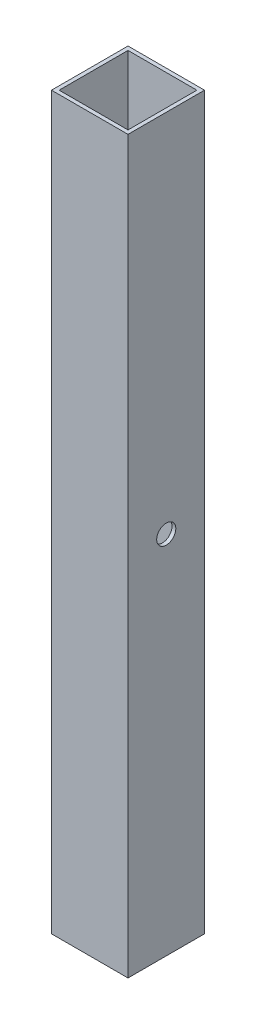
ISO-10303-21;
HEADER;
FILE_DESCRIPTION(('STEP AP214'),'2;1');
FILE_NAME('part.step','',(''),(''),'','','');
FILE_SCHEMA(('AUTOMOTIVE_DESIGN { 1 0 10303 214 1 1 1 1 }'));
ENDSEC;
DATA;
#1=APPLICATION_CONTEXT('core data for automotive mechanical design processes');
#2=APPLICATION_PROTOCOL_DEFINITION('international standard','automotive_design',2000,#1);
#3=PRODUCT_CONTEXT('',#1,'mechanical');
#4=PRODUCT('Part','Part','',(#3));
#5=PRODUCT_RELATED_PRODUCT_CATEGORY('part','',(#4));
#6=PRODUCT_DEFINITION_FORMATION('','',#4);
#7=PRODUCT_DEFINITION_CONTEXT('part definition',#1,'design');
#8=PRODUCT_DEFINITION('design','',#6,#7);
#9=PRODUCT_DEFINITION_SHAPE('','',#8);
#10=(LENGTH_UNIT() NAMED_UNIT(*) SI_UNIT(.MILLI.,.METRE.));
#11=(NAMED_UNIT(*) PLANE_ANGLE_UNIT() SI_UNIT($,.RADIAN.));
#12=(NAMED_UNIT(*) SI_UNIT($,.STERADIAN.) SOLID_ANGLE_UNIT());
#13=UNCERTAINTY_MEASURE_WITH_UNIT(LENGTH_MEASURE(1.E-05),#10,'distance_accuracy_value','');
#14=(GEOMETRIC_REPRESENTATION_CONTEXT(3) GLOBAL_UNCERTAINTY_ASSIGNED_CONTEXT((#13)) GLOBAL_UNIT_ASSIGNED_CONTEXT((#10,
#11,#12)) REPRESENTATION_CONTEXT('',''));
#15=CARTESIAN_POINT('',(0.,0.,0.));
#16=DIRECTION('',(0.,0.,1.));
#17=DIRECTION('',(1.,0.,0.));
#18=AXIS2_PLACEMENT_3D('',#15,#16,#17);
#19=CARTESIAN_POINT('',(0.,191.,0.));
#20=DIRECTION('',(0.,-1.,0.));
#21=DIRECTION('',(0.,0.,-1.));
#22=AXIS2_PLACEMENT_3D('',#19,#20,#21);
#23=PLANE('',#22);
#24=DIRECTION('',(0.,0.,-1.));
#25=VECTOR('',#24,1.);
#26=CARTESIAN_POINT('',(9.99999999999999,191.,10.));
#27=LINE('',#26,#25);
#28=CARTESIAN_POINT('',(9.99999999999999,191.,10.));
#29=VERTEX_POINT('',#28);
#30=CARTESIAN_POINT('',(9.99999999999999,191.,-9.99999999999999));
#31=VERTEX_POINT('',#30);
#32=EDGE_CURVE('E137',#29,#31,#27,.T.);
#33=ORIENTED_EDGE('',*,*,#32,.T.);
#34=DIRECTION('',(-1.,0.,0.));
#35=VECTOR('',#34,1.);
#36=CARTESIAN_POINT('',(-10.,191.,-9.99999999999999));
#37=LINE('',#36,#35);
#38=CARTESIAN_POINT('',(-10.,191.,-9.99999999999999));
#39=VERTEX_POINT('',#38);
#40=EDGE_CURVE('E140',#31,#39,#37,.T.);
#41=ORIENTED_EDGE('',*,*,#40,.T.);
#42=DIRECTION('',(0.,0.,1.));
#43=VECTOR('',#42,1.);
#44=CARTESIAN_POINT('',(-10.,191.,10.));
#45=LINE('',#44,#43);
#46=CARTESIAN_POINT('',(-10.,191.,10.));
#47=VERTEX_POINT('',#46);
#48=EDGE_CURVE('E143',#39,#47,#45,.T.);
#49=ORIENTED_EDGE('',*,*,#48,.T.);
#50=DIRECTION('',(1.,0.,0.));
#51=VECTOR('',#50,1.);
#52=CARTESIAN_POINT('',(-10.,191.,10.));
#53=LINE('',#52,#51);
#54=EDGE_CURVE('E145',#47,#29,#53,.T.);
#55=ORIENTED_EDGE('',*,*,#54,.T.);
#56=EDGE_LOOP('',(#33,#41,#49,#55));
#57=FACE_BOUND('',#56,.T.);
#58=DIRECTION('',(0.,0.,-1.));
#59=VECTOR('',#58,1.);
#60=CARTESIAN_POINT('',(9.,191.,9.));
#61=LINE('',#60,#59);
#62=CARTESIAN_POINT('',(9.,191.,9.));
#63=VERTEX_POINT('',#62);
#64=CARTESIAN_POINT('',(9.,191.,-9.));
#65=VERTEX_POINT('',#64);
#66=EDGE_CURVE('E99',#63,#65,#61,.T.);
#67=ORIENTED_EDGE('',*,*,#66,.F.);
#68=DIRECTION('',(1.,0.,0.));
#69=VECTOR('',#68,1.);
#70=CARTESIAN_POINT('',(-9.,191.,9.));
#71=LINE('',#70,#69);
#72=CARTESIAN_POINT('',(-9.,191.,9.));
#73=VERTEX_POINT('',#72);
#74=EDGE_CURVE('E121',#73,#63,#71,.T.);
#75=ORIENTED_EDGE('',*,*,#74,.F.);
#76=DIRECTION('',(0.,0.,1.));
#77=VECTOR('',#76,1.);
#78=CARTESIAN_POINT('',(-9.,191.,9.));
#79=LINE('',#78,#77);
#80=CARTESIAN_POINT('',(-9.,191.,-9.));
#81=VERTEX_POINT('',#80);
#82=EDGE_CURVE('E119',#81,#73,#79,.T.);
#83=ORIENTED_EDGE('',*,*,#82,.F.);
#84=DIRECTION('',(-1.,0.,0.));
#85=VECTOR('',#84,1.);
#86=CARTESIAN_POINT('',(-9.,191.,-9.));
#87=LINE('',#86,#85);
#88=EDGE_CURVE('E107',#65,#81,#87,.T.);
#89=ORIENTED_EDGE('',*,*,#88,.F.);
#90=EDGE_LOOP('',(#67,#75,#83,#89));
#91=FACE_BOUND('',#90,.T.);
#92=ADVANCED_FACE('F33',(#57,#91),#23,.F.);
#93=CARTESIAN_POINT('',(0.,0.,0.));
#94=DIRECTION('',(0.,-1.,0.));
#95=DIRECTION('',(0.,0.,-1.));
#96=AXIS2_PLACEMENT_3D('',#93,#94,#95);
#97=PLANE('',#96);
#98=DIRECTION('',(0.,0.,-1.));
#99=VECTOR('',#98,1.);
#100=CARTESIAN_POINT('',(9.99999999999999,0.,10.));
#101=LINE('',#100,#99);
#102=CARTESIAN_POINT('',(9.99999999999999,0.,10.));
#103=VERTEX_POINT('',#102);
#104=CARTESIAN_POINT('',(9.99999999999999,0.,-9.99999999999999));
#105=VERTEX_POINT('',#104);
#106=EDGE_CURVE('E115',#103,#105,#101,.T.);
#107=ORIENTED_EDGE('',*,*,#106,.F.);
#108=DIRECTION('',(1.,0.,0.));
#109=VECTOR('',#108,1.);
#110=CARTESIAN_POINT('',(-10.,0.,10.));
#111=LINE('',#110,#109);
#112=CARTESIAN_POINT('',(-10.,0.,10.));
#113=VERTEX_POINT('',#112);
#114=EDGE_CURVE('E141',#113,#103,#111,.T.);
#115=ORIENTED_EDGE('',*,*,#114,.F.);
#116=DIRECTION('',(0.,0.,1.));
#117=VECTOR('',#116,1.);
#118=CARTESIAN_POINT('',(-10.,0.,10.));
#119=LINE('',#118,#117);
#120=CARTESIAN_POINT('',(-10.,0.,-9.99999999999999));
#121=VERTEX_POINT('',#120);
#122=EDGE_CURVE('E152',#121,#113,#119,.T.);
#123=ORIENTED_EDGE('',*,*,#122,.F.);
#124=DIRECTION('',(-1.,0.,0.));
#125=VECTOR('',#124,1.);
#126=CARTESIAN_POINT('',(-10.,0.,-9.99999999999999));
#127=LINE('',#126,#125);
#128=EDGE_CURVE('E150',#105,#121,#127,.T.);
#129=ORIENTED_EDGE('',*,*,#128,.F.);
#130=EDGE_LOOP('',(#107,#115,#123,#129));
#131=FACE_BOUND('',#130,.T.);
#132=DIRECTION('',(1.,0.,0.));
#133=VECTOR('',#132,1.);
#134=CARTESIAN_POINT('',(-9.,0.,9.));
#135=LINE('',#134,#133);
#136=CARTESIAN_POINT('',(-9.,0.,9.));
#137=VERTEX_POINT('',#136);
#138=CARTESIAN_POINT('',(9.,0.,9.));
#139=VERTEX_POINT('',#138);
#140=EDGE_CURVE('E108',#137,#139,#135,.T.);
#141=ORIENTED_EDGE('',*,*,#140,.T.);
#142=DIRECTION('',(0.,0.,-1.));
#143=VECTOR('',#142,1.);
#144=CARTESIAN_POINT('',(9.,0.,9.));
#145=LINE('',#144,#143);
#146=CARTESIAN_POINT('',(9.,0.,-9.));
#147=VERTEX_POINT('',#146);
#148=EDGE_CURVE('E57',#139,#147,#145,.T.);
#149=ORIENTED_EDGE('',*,*,#148,.T.);
#150=DIRECTION('',(-1.,0.,0.));
#151=VECTOR('',#150,1.);
#152=CARTESIAN_POINT('',(-9.,0.,-9.));
#153=LINE('',#152,#151);
#154=CARTESIAN_POINT('',(-9.,0.,-9.));
#155=VERTEX_POINT('',#154);
#156=EDGE_CURVE('E114',#147,#155,#153,.T.);
#157=ORIENTED_EDGE('',*,*,#156,.T.);
#158=DIRECTION('',(0.,0.,1.));
#159=VECTOR('',#158,1.);
#160=CARTESIAN_POINT('',(-9.,0.,9.));
#161=LINE('',#160,#159);
#162=EDGE_CURVE('E129',#155,#137,#161,.T.);
#163=ORIENTED_EDGE('',*,*,#162,.T.);
#164=EDGE_LOOP('',(#141,#149,#157,#163));
#165=FACE_BOUND('',#164,.T.);
#166=ADVANCED_FACE('F171',(#131,#165),#97,.T.);
#167=CARTESIAN_POINT('',(9.99999999999999,191.,10.));
#168=DIRECTION('',(-1.,0.,0.));
#169=DIRECTION('',(0.,0.,1.));
#170=AXIS2_PLACEMENT_3D('',#167,#168,#169);
#171=PLANE('',#170);
#172=CARTESIAN_POINT('',(9.99999999999999,95.5,0.));
#173=DIRECTION('',(-1.,0.,0.));
#174=DIRECTION('',(0.,0.,1.));
#175=AXIS2_PLACEMENT_3D('',#172,#173,#174);
#176=CIRCLE('',#175,2.5);
#177=CARTESIAN_POINT('',(9.99999999999999,95.5,2.5));
#178=VERTEX_POINT('',#177);
#179=EDGE_CURVE('E218',#178,#178,#176,.T.);
#180=ORIENTED_EDGE('',*,*,#179,.T.);
#181=EDGE_LOOP('',(#180));
#182=FACE_BOUND('',#181,.T.);
#183=ORIENTED_EDGE('',*,*,#106,.T.);
#184=DIRECTION('',(0.,-1.,0.));
#185=VECTOR('',#184,1.);
#186=CARTESIAN_POINT('',(9.99999999999999,191.,-9.99999999999999));
#187=LINE('',#186,#185);
#188=EDGE_CURVE('E11',#31,#105,#187,.T.);
#189=ORIENTED_EDGE('',*,*,#188,.F.);
#190=ORIENTED_EDGE('',*,*,#32,.F.);
#191=DIRECTION('',(0.,-1.,0.));
#192=VECTOR('',#191,1.);
#193=CARTESIAN_POINT('',(9.99999999999999,191.,10.));
#194=LINE('',#193,#192);
#195=EDGE_CURVE('E147',#29,#103,#194,.T.);
#196=ORIENTED_EDGE('',*,*,#195,.T.);
#197=EDGE_LOOP('',(#183,#189,#190,#196));
#198=FACE_BOUND('',#197,.T.);
#199=ADVANCED_FACE('F35',(#182,#198),#171,.F.);
#200=CARTESIAN_POINT('',(-10.,191.,-9.99999999999999));
#201=DIRECTION('',(0.,0.,1.));
#202=DIRECTION('',(1.,0.,0.));
#203=AXIS2_PLACEMENT_3D('',#200,#201,#202);
#204=PLANE('',#203);
#205=ORIENTED_EDGE('',*,*,#128,.T.);
#206=DIRECTION('',(0.,-1.,0.));
#207=VECTOR('',#206,1.);
#208=CARTESIAN_POINT('',(-10.,191.,-9.99999999999999));
#209=LINE('',#208,#207);
#210=EDGE_CURVE('E42',#39,#121,#209,.T.);
#211=ORIENTED_EDGE('',*,*,#210,.F.);
#212=ORIENTED_EDGE('',*,*,#40,.F.);
#213=ORIENTED_EDGE('',*,*,#188,.T.);
#214=EDGE_LOOP('',(#205,#211,#212,#213));
#215=FACE_BOUND('',#214,.T.);
#216=ADVANCED_FACE('F181',(#215),#204,.F.);
#217=CARTESIAN_POINT('',(-10.,191.,10.));
#218=DIRECTION('',(1.,0.,0.));
#219=DIRECTION('',(0.,0.,-1.));
#220=AXIS2_PLACEMENT_3D('',#217,#218,#219);
#221=PLANE('',#220);
#222=CARTESIAN_POINT('',(-10.,95.5,0.));
#223=DIRECTION('',(1.,0.,0.));
#224=DIRECTION('',(0.,0.,-1.));
#225=AXIS2_PLACEMENT_3D('',#222,#223,#224);
#226=CIRCLE('',#225,2.5);
#227=CARTESIAN_POINT('',(-10.,95.5,-2.5));
#228=VERTEX_POINT('',#227);
#229=EDGE_CURVE('E127',#228,#228,#226,.T.);
#230=ORIENTED_EDGE('',*,*,#229,.T.);
#231=EDGE_LOOP('',(#230));
#232=FACE_BOUND('',#231,.T.);
#233=ORIENTED_EDGE('',*,*,#122,.T.);
#234=DIRECTION('',(0.,-1.,0.));
#235=VECTOR('',#234,1.);
#236=CARTESIAN_POINT('',(-10.,191.,10.));
#237=LINE('',#236,#235);
#238=EDGE_CURVE('E157',#47,#113,#237,.T.);
#239=ORIENTED_EDGE('',*,*,#238,.F.);
#240=ORIENTED_EDGE('',*,*,#48,.F.);
#241=ORIENTED_EDGE('',*,*,#210,.T.);
#242=EDGE_LOOP('',(#233,#239,#240,#241));
#243=FACE_BOUND('',#242,.T.);
#244=ADVANCED_FACE('F165',(#232,#243),#221,.F.);
#245=CARTESIAN_POINT('',(-10.,191.,10.));
#246=DIRECTION('',(0.,0.,-1.));
#247=DIRECTION('',(-1.,0.,0.));
#248=AXIS2_PLACEMENT_3D('',#245,#246,#247);
#249=PLANE('',#248);
#250=ORIENTED_EDGE('',*,*,#114,.T.);
#251=ORIENTED_EDGE('',*,*,#195,.F.);
#252=ORIENTED_EDGE('',*,*,#54,.F.);
#253=ORIENTED_EDGE('',*,*,#238,.T.);
#254=EDGE_LOOP('',(#250,#251,#252,#253));
#255=FACE_BOUND('',#254,.T.);
#256=ADVANCED_FACE('F175',(#255),#249,.F.);
#257=CARTESIAN_POINT('',(9.,191.,9.));
#258=DIRECTION('',(-1.,0.,0.));
#259=DIRECTION('',(0.,0.,1.));
#260=AXIS2_PLACEMENT_3D('',#257,#258,#259);
#261=PLANE('',#260);
#262=CARTESIAN_POINT('',(9.,95.5,0.));
#263=DIRECTION('',(-1.,0.,0.));
#264=DIRECTION('',(0.,0.,1.));
#265=AXIS2_PLACEMENT_3D('',#262,#263,#264);
#266=CIRCLE('',#265,2.5);
#267=CARTESIAN_POINT('',(9.,95.5,2.5));
#268=VERTEX_POINT('',#267);
#269=EDGE_CURVE('E213',#268,#268,#266,.T.);
#270=ORIENTED_EDGE('',*,*,#269,.F.);
#271=EDGE_LOOP('',(#270));
#272=FACE_BOUND('',#271,.T.);
#273=ORIENTED_EDGE('',*,*,#148,.F.);
#274=DIRECTION('',(0.,-1.,0.));
#275=VECTOR('',#274,1.);
#276=CARTESIAN_POINT('',(9.,191.,9.));
#277=LINE('',#276,#275);
#278=EDGE_CURVE('E103',#63,#139,#277,.T.);
#279=ORIENTED_EDGE('',*,*,#278,.F.);
#280=ORIENTED_EDGE('',*,*,#66,.T.);
#281=DIRECTION('',(0.,-1.,0.));
#282=VECTOR('',#281,1.);
#283=CARTESIAN_POINT('',(9.,191.,-9.));
#284=LINE('',#283,#282);
#285=EDGE_CURVE('E102',#65,#147,#284,.T.);
#286=ORIENTED_EDGE('',*,*,#285,.T.);
#287=EDGE_LOOP('',(#273,#279,#280,#286));
#288=FACE_BOUND('',#287,.T.);
#289=ADVANCED_FACE('F101',(#272,#288),#261,.T.);
#290=CARTESIAN_POINT('',(-9.,191.,-9.));
#291=DIRECTION('',(0.,0.,1.));
#292=DIRECTION('',(1.,0.,0.));
#293=AXIS2_PLACEMENT_3D('',#290,#291,#292);
#294=PLANE('',#293);
#295=ORIENTED_EDGE('',*,*,#156,.F.);
#296=ORIENTED_EDGE('',*,*,#285,.F.);
#297=ORIENTED_EDGE('',*,*,#88,.T.);
#298=DIRECTION('',(0.,-1.,0.));
#299=VECTOR('',#298,1.);
#300=CARTESIAN_POINT('',(-9.,191.,-9.));
#301=LINE('',#300,#299);
#302=EDGE_CURVE('E116',#81,#155,#301,.T.);
#303=ORIENTED_EDGE('',*,*,#302,.T.);
#304=EDGE_LOOP('',(#295,#296,#297,#303));
#305=FACE_BOUND('',#304,.T.);
#306=ADVANCED_FACE('F111',(#305),#294,.T.);
#307=CARTESIAN_POINT('',(-9.,191.,9.));
#308=DIRECTION('',(1.,0.,0.));
#309=DIRECTION('',(0.,0.,-1.));
#310=AXIS2_PLACEMENT_3D('',#307,#308,#309);
#311=PLANE('',#310);
#312=CARTESIAN_POINT('',(-9.,95.5,0.));
#313=DIRECTION('',(1.,0.,0.));
#314=DIRECTION('',(0.,0.,-1.));
#315=AXIS2_PLACEMENT_3D('',#312,#313,#314);
#316=CIRCLE('',#315,2.5);
#317=CARTESIAN_POINT('',(-9.,95.5,-2.5));
#318=VERTEX_POINT('',#317);
#319=EDGE_CURVE('E37',#318,#318,#316,.T.);
#320=ORIENTED_EDGE('',*,*,#319,.F.);
#321=EDGE_LOOP('',(#320));
#322=FACE_BOUND('',#321,.T.);
#323=ORIENTED_EDGE('',*,*,#162,.F.);
#324=ORIENTED_EDGE('',*,*,#302,.F.);
#325=ORIENTED_EDGE('',*,*,#82,.T.);
#326=DIRECTION('',(0.,-1.,0.));
#327=VECTOR('',#326,1.);
#328=CARTESIAN_POINT('',(-9.,191.,9.));
#329=LINE('',#328,#327);
#330=EDGE_CURVE('E49',#73,#137,#329,.T.);
#331=ORIENTED_EDGE('',*,*,#330,.T.);
#332=EDGE_LOOP('',(#323,#324,#325,#331));
#333=FACE_BOUND('',#332,.T.);
#334=ADVANCED_FACE('F210',(#322,#333),#311,.T.);
#335=CARTESIAN_POINT('',(-9.,191.,9.));
#336=DIRECTION('',(0.,0.,-1.));
#337=DIRECTION('',(-1.,0.,0.));
#338=AXIS2_PLACEMENT_3D('',#335,#336,#337);
#339=PLANE('',#338);
#340=ORIENTED_EDGE('',*,*,#140,.F.);
#341=ORIENTED_EDGE('',*,*,#330,.F.);
#342=ORIENTED_EDGE('',*,*,#74,.T.);
#343=ORIENTED_EDGE('',*,*,#278,.T.);
#344=EDGE_LOOP('',(#340,#341,#342,#343));
#345=FACE_BOUND('',#344,.T.);
#346=ADVANCED_FACE('F230',(#345),#339,.T.);
#347=CARTESIAN_POINT('',(9.99999999999999,95.5,0.));
#348=DIRECTION('',(-1.,0.,0.));
#349=DIRECTION('',(0.,0.,1.));
#350=AXIS2_PLACEMENT_3D('',#347,#348,#349);
#351=CYLINDRICAL_SURFACE('',#350,2.5);
#352=ORIENTED_EDGE('',*,*,#319,.T.);
#353=EDGE_LOOP('',(#352));
#354=FACE_BOUND('',#353,.T.);
#355=ORIENTED_EDGE('',*,*,#229,.F.);
#356=EDGE_LOOP('',(#355));
#357=FACE_BOUND('',#356,.T.);
#358=ADVANCED_FACE('F225',(#354,#357),#351,.F.);
#359=ORIENTED_EDGE('',*,*,#269,.T.);
#360=EDGE_LOOP('',(#359));
#361=FACE_BOUND('',#360,.T.);
#362=ORIENTED_EDGE('',*,*,#179,.F.);
#363=EDGE_LOOP('',(#362));
#364=FACE_BOUND('',#363,.T.);
#365=ADVANCED_FACE('F223',(#361,#364),#351,.F.);
#366=CLOSED_SHELL('',(#92,#166,#199,#216,#244,#256,#289,#306,#334,#346,#358,#365));
#367=MANIFOLD_SOLID_BREP('B2',#366);
#368=ADVANCED_BREP_SHAPE_REPRESENTATION('',(#18,#367),#14);
#369=SHAPE_DEFINITION_REPRESENTATION(#9,#368);
ENDSEC;
END-ISO-10303-21;
